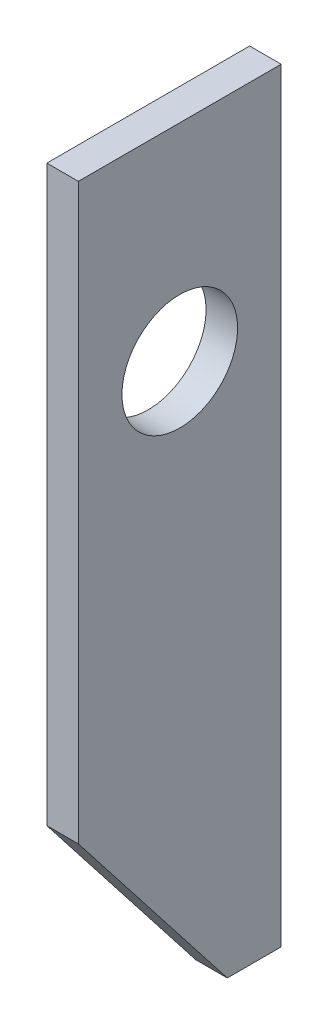
ISO-10303-21;
HEADER;
FILE_DESCRIPTION(('STEP AP214'),'2;1');
FILE_NAME('part.step','',(''),(''),'','','');
FILE_SCHEMA(('AUTOMOTIVE_DESIGN { 1 0 10303 214 1 1 1 1 }'));
ENDSEC;
DATA;
#1=APPLICATION_CONTEXT('core data for automotive mechanical design processes');
#2=APPLICATION_PROTOCOL_DEFINITION('international standard','automotive_design',2000,#1);
#3=PRODUCT_CONTEXT('',#1,'mechanical');
#4=PRODUCT('Part','Part','',(#3));
#5=PRODUCT_RELATED_PRODUCT_CATEGORY('part','',(#4));
#6=PRODUCT_DEFINITION_FORMATION('','',#4);
#7=PRODUCT_DEFINITION_CONTEXT('part definition',#1,'design');
#8=PRODUCT_DEFINITION('design','',#6,#7);
#9=PRODUCT_DEFINITION_SHAPE('','',#8);
#10=(LENGTH_UNIT() NAMED_UNIT(*) SI_UNIT(.MILLI.,.METRE.));
#11=(NAMED_UNIT(*) PLANE_ANGLE_UNIT() SI_UNIT($,.RADIAN.));
#12=(NAMED_UNIT(*) SI_UNIT($,.STERADIAN.) SOLID_ANGLE_UNIT());
#13=UNCERTAINTY_MEASURE_WITH_UNIT(LENGTH_MEASURE(1.E-05),#10,'distance_accuracy_value','');
#14=(GEOMETRIC_REPRESENTATION_CONTEXT(3) GLOBAL_UNCERTAINTY_ASSIGNED_CONTEXT((#13)) GLOBAL_UNIT_ASSIGNED_CONTEXT((#10,
#11,#12)) REPRESENTATION_CONTEXT('',''));
#15=CARTESIAN_POINT('',(0.,0.,0.));
#16=DIRECTION('',(0.,0.,1.));
#17=DIRECTION('',(1.,0.,0.));
#18=AXIS2_PLACEMENT_3D('',#15,#16,#17);
#19=CARTESIAN_POINT('',(3.,-36.3482993822892,-9.64296264280795));
#20=DIRECTION('',(0.,0.,1.));
#21=DIRECTION('',(0.,-1.,0.));
#22=AXIS2_PLACEMENT_3D('',#19,#20,#21);
#23=PLANE('',#22);
#24=DIRECTION('',(0.,1.,0.));
#25=VECTOR('',#24,1.);
#26=CARTESIAN_POINT('',(0.,-36.3482993822892,-9.64296264280795));
#27=LINE('',#26,#25);
#28=CARTESIAN_POINT('',(0.,-36.3482993822892,-9.64296264280795));
#29=VERTEX_POINT('',#28);
#30=CARTESIAN_POINT('',(0.,36.3482993822892,-9.64296264280801));
#31=VERTEX_POINT('',#30);
#32=EDGE_CURVE('E122',#29,#31,#27,.T.);
#33=ORIENTED_EDGE('',*,*,#32,.T.);
#34=DIRECTION('',(-1.,0.,0.));
#35=VECTOR('',#34,1.);
#36=CARTESIAN_POINT('',(3.,36.3482993822892,-9.64296264280801));
#37=LINE('',#36,#35);
#38=CARTESIAN_POINT('',(3.,36.3482993822892,-9.64296264280801));
#39=VERTEX_POINT('',#38);
#40=EDGE_CURVE('E11',#39,#31,#37,.T.);
#41=ORIENTED_EDGE('',*,*,#40,.F.);
#42=DIRECTION('',(0.,1.,0.));
#43=VECTOR('',#42,1.);
#44=CARTESIAN_POINT('',(3.,-36.3482993822892,-9.64296264280795));
#45=LINE('',#44,#43);
#46=CARTESIAN_POINT('',(3.,-36.3482993822892,-9.64296264280795));
#47=VERTEX_POINT('',#46);
#48=EDGE_CURVE('E136',#47,#39,#45,.T.);
#49=ORIENTED_EDGE('',*,*,#48,.F.);
#50=DIRECTION('',(-1.,0.,0.));
#51=VECTOR('',#50,1.);
#52=CARTESIAN_POINT('',(3.,-36.3482993822892,-9.64296264280795));
#53=LINE('',#52,#51);
#54=EDGE_CURVE('E118',#47,#29,#53,.T.);
#55=ORIENTED_EDGE('',*,*,#54,.T.);
#56=EDGE_LOOP('',(#33,#41,#49,#55));
#57=FACE_BOUND('',#56,.T.);
#58=ADVANCED_FACE('F43',(#57),#23,.F.);
#59=CARTESIAN_POINT('',(3.,36.3482993822892,-9.64296264280801));
#60=DIRECTION('',(0.,-1.,0.));
#61=DIRECTION('',(0.,0.,-1.));
#62=AXIS2_PLACEMENT_3D('',#59,#60,#61);
#63=PLANE('',#62);
#64=DIRECTION('',(0.,0.,1.));
#65=VECTOR('',#64,1.);
#66=CARTESIAN_POINT('',(0.,36.3482993822892,-9.64296264280801));
#67=LINE('',#66,#65);
#68=CARTESIAN_POINT('',(0.,36.3482993822892,9.64296264280806));
#69=VERTEX_POINT('',#68);
#70=EDGE_CURVE('E126',#31,#69,#67,.T.);
#71=ORIENTED_EDGE('',*,*,#70,.T.);
#72=DIRECTION('',(-1.,0.,0.));
#73=VECTOR('',#72,1.);
#74=CARTESIAN_POINT('',(3.,36.3482993822892,9.64296264280806));
#75=LINE('',#74,#73);
#76=CARTESIAN_POINT('',(3.,36.3482993822892,9.64296264280806));
#77=VERTEX_POINT('',#76);
#78=EDGE_CURVE('E52',#77,#69,#75,.T.);
#79=ORIENTED_EDGE('',*,*,#78,.F.);
#80=DIRECTION('',(0.,0.,1.));
#81=VECTOR('',#80,1.);
#82=CARTESIAN_POINT('',(3.,36.3482993822892,-9.64296264280801));
#83=LINE('',#82,#81);
#84=EDGE_CURVE('E94',#39,#77,#83,.T.);
#85=ORIENTED_EDGE('',*,*,#84,.F.);
#86=ORIENTED_EDGE('',*,*,#40,.T.);
#87=EDGE_LOOP('',(#71,#79,#85,#86));
#88=FACE_BOUND('',#87,.T.);
#89=ADVANCED_FACE('F159',(#88),#63,.F.);
#90=CARTESIAN_POINT('',(3.,36.3482993822892,9.64296264280806));
#91=DIRECTION('',(0.,0.,-1.));
#92=DIRECTION('',(-1.,0.,0.));
#93=AXIS2_PLACEMENT_3D('',#90,#91,#92);
#94=PLANE('',#93);
#95=DIRECTION('',(0.,-1.,0.));
#96=VECTOR('',#95,1.);
#97=CARTESIAN_POINT('',(0.,36.3482993822892,9.64296264280806));
#98=LINE('',#97,#96);
#99=CARTESIAN_POINT('',(0.,-18.2201645609676,9.64296264280806));
#100=VERTEX_POINT('',#99);
#101=EDGE_CURVE('E110',#69,#100,#98,.T.);
#102=ORIENTED_EDGE('',*,*,#101,.T.);
#103=DIRECTION('',(-1.,0.,0.));
#104=VECTOR('',#103,1.);
#105=CARTESIAN_POINT('',(3.,-18.2201645609676,9.64296264280806));
#106=LINE('',#105,#104);
#107=CARTESIAN_POINT('',(3.,-18.2201645609676,9.64296264280806));
#108=VERTEX_POINT('',#107);
#109=EDGE_CURVE('E107',#108,#100,#106,.T.);
#110=ORIENTED_EDGE('',*,*,#109,.F.);
#111=DIRECTION('',(0.,-1.,0.));
#112=VECTOR('',#111,1.);
#113=CARTESIAN_POINT('',(3.,36.3482993822892,9.64296264280806));
#114=LINE('',#113,#112);
#115=EDGE_CURVE('E98',#77,#108,#114,.T.);
#116=ORIENTED_EDGE('',*,*,#115,.F.);
#117=ORIENTED_EDGE('',*,*,#78,.T.);
#118=EDGE_LOOP('',(#102,#110,#116,#117));
#119=FACE_BOUND('',#118,.T.);
#120=ADVANCED_FACE('F108',(#119),#94,.F.);
#121=CARTESIAN_POINT('',(3.,-18.2201645609676,9.64296264280806));
#122=DIRECTION('',(0.,0.615661475325662,-0.788010753606719));
#123=DIRECTION('',(0.,0.788010753606719,0.615661475325662));
#124=AXIS2_PLACEMENT_3D('',#121,#122,#123);
#125=PLANE('',#124);
#126=DIRECTION('',(0.,-0.788010753606719,-0.615661475325662));
#127=VECTOR('',#126,1.);
#128=CARTESIAN_POINT('',(0.,-18.2201645609676,9.64296264280806));
#129=LINE('',#128,#127);
#130=CARTESIAN_POINT('',(0.,-36.3482993822892,-4.52028852846653));
#131=VERTEX_POINT('',#130);
#132=EDGE_CURVE('E80',#100,#131,#129,.T.);
#133=ORIENTED_EDGE('',*,*,#132,.T.);
#134=DIRECTION('',(-1.,0.,0.));
#135=VECTOR('',#134,1.);
#136=CARTESIAN_POINT('',(3.,-36.3482993822892,-4.52028852846653));
#137=LINE('',#136,#135);
#138=CARTESIAN_POINT('',(3.,-36.3482993822892,-4.52028852846653));
#139=VERTEX_POINT('',#138);
#140=EDGE_CURVE('E112',#139,#131,#137,.T.);
#141=ORIENTED_EDGE('',*,*,#140,.F.);
#142=DIRECTION('',(0.,-0.788010753606719,-0.615661475325662));
#143=VECTOR('',#142,1.);
#144=CARTESIAN_POINT('',(3.,-18.2201645609676,9.64296264280806));
#145=LINE('',#144,#143);
#146=EDGE_CURVE('E102',#108,#139,#145,.T.);
#147=ORIENTED_EDGE('',*,*,#146,.F.);
#148=ORIENTED_EDGE('',*,*,#109,.T.);
#149=EDGE_LOOP('',(#133,#141,#147,#148));
#150=FACE_BOUND('',#149,.T.);
#151=ADVANCED_FACE('F114',(#150),#125,.F.);
#152=CARTESIAN_POINT('',(3.,-36.3482993822892,-4.52028852846653));
#153=DIRECTION('',(0.,1.,0.));
#154=DIRECTION('',(0.,0.,1.));
#155=AXIS2_PLACEMENT_3D('',#152,#153,#154);
#156=PLANE('',#155);
#157=DIRECTION('',(0.,0.,-1.));
#158=VECTOR('',#157,1.);
#159=CARTESIAN_POINT('',(0.,-36.3482993822892,-4.52028852846653));
#160=LINE('',#159,#158);
#161=EDGE_CURVE('E86',#131,#29,#160,.T.);
#162=ORIENTED_EDGE('',*,*,#161,.T.);
#163=ORIENTED_EDGE('',*,*,#54,.F.);
#164=DIRECTION('',(0.,0.,-1.));
#165=VECTOR('',#164,1.);
#166=CARTESIAN_POINT('',(3.,-36.3482993822892,-4.52028852846653));
#167=LINE('',#166,#165);
#168=EDGE_CURVE('E60',#139,#47,#167,.T.);
#169=ORIENTED_EDGE('',*,*,#168,.F.);
#170=ORIENTED_EDGE('',*,*,#140,.T.);
#171=EDGE_LOOP('',(#162,#163,#169,#170));
#172=FACE_BOUND('',#171,.T.);
#173=ADVANCED_FACE('F147',(#172),#156,.F.);
#174=CARTESIAN_POINT('',(3.,0.,0.));
#175=DIRECTION('',(1.,0.,0.));
#176=DIRECTION('',(0.,0.,-1.));
#177=AXIS2_PLACEMENT_3D('',#174,#175,#176);
#178=PLANE('',#177);
#179=CARTESIAN_POINT('',(3.,16.706183396475,0.));
#180=DIRECTION('',(-1.,0.,0.));
#181=DIRECTION('',(0.,0.,1.));
#182=AXIS2_PLACEMENT_3D('',#179,#180,#181);
#183=CIRCLE('',#182,5.5);
#184=CARTESIAN_POINT('',(3.,16.706183396475,5.50000000000009));
#185=VERTEX_POINT('',#184);
#186=EDGE_CURVE('E127',#185,#185,#183,.T.);
#187=ORIENTED_EDGE('',*,*,#186,.T.);
#188=EDGE_LOOP('',(#187));
#189=FACE_BOUND('',#188,.T.);
#190=ORIENTED_EDGE('',*,*,#48,.T.);
#191=ORIENTED_EDGE('',*,*,#84,.T.);
#192=ORIENTED_EDGE('',*,*,#115,.T.);
#193=ORIENTED_EDGE('',*,*,#146,.T.);
#194=ORIENTED_EDGE('',*,*,#168,.T.);
#195=EDGE_LOOP('',(#190,#191,#192,#193,#194));
#196=FACE_BOUND('',#195,.T.);
#197=ADVANCED_FACE('F100',(#189,#196),#178,.T.);
#198=CARTESIAN_POINT('',(0.,0.,0.));
#199=DIRECTION('',(1.,0.,0.));
#200=DIRECTION('',(0.,0.,-1.));
#201=AXIS2_PLACEMENT_3D('',#198,#199,#200);
#202=PLANE('',#201);
#203=CARTESIAN_POINT('',(0.,16.706183396475,0.));
#204=DIRECTION('',(-1.,0.,0.));
#205=DIRECTION('',(0.,0.,1.));
#206=AXIS2_PLACEMENT_3D('',#203,#204,#205);
#207=CIRCLE('',#206,5.5);
#208=CARTESIAN_POINT('',(0.,16.706183396475,5.50000000000009));
#209=VERTEX_POINT('',#208);
#210=EDGE_CURVE('E236',#209,#209,#207,.T.);
#211=ORIENTED_EDGE('',*,*,#210,.F.);
#212=EDGE_LOOP('',(#211));
#213=FACE_BOUND('',#212,.T.);
#214=ORIENTED_EDGE('',*,*,#32,.F.);
#215=ORIENTED_EDGE('',*,*,#161,.F.);
#216=ORIENTED_EDGE('',*,*,#132,.F.);
#217=ORIENTED_EDGE('',*,*,#101,.F.);
#218=ORIENTED_EDGE('',*,*,#70,.F.);
#219=EDGE_LOOP('',(#214,#215,#216,#217,#218));
#220=FACE_BOUND('',#219,.T.);
#221=ADVANCED_FACE('F143',(#213,#220),#202,.F.);
#222=CARTESIAN_POINT('',(3.,16.706183396475,0.));
#223=DIRECTION('',(-1.,0.,0.));
#224=DIRECTION('',(0.,0.,1.));
#225=AXIS2_PLACEMENT_3D('',#222,#223,#224);
#226=CYLINDRICAL_SURFACE('',#225,5.5);
#227=ORIENTED_EDGE('',*,*,#186,.F.);
#228=EDGE_LOOP('',(#227));
#229=FACE_BOUND('',#228,.T.);
#230=ORIENTED_EDGE('',*,*,#210,.T.);
#231=EDGE_LOOP('',(#230));
#232=FACE_BOUND('',#231,.T.);
#233=ADVANCED_FACE('F195',(#229,#232),#226,.F.);
#234=CLOSED_SHELL('',(#58,#89,#120,#151,#173,#197,#221,#233));
#235=MANIFOLD_SOLID_BREP('B2',#234);
#236=ADVANCED_BREP_SHAPE_REPRESENTATION('',(#18,#235),#14);
#237=SHAPE_DEFINITION_REPRESENTATION(#9,#236);
ENDSEC;
END-ISO-10303-21;
